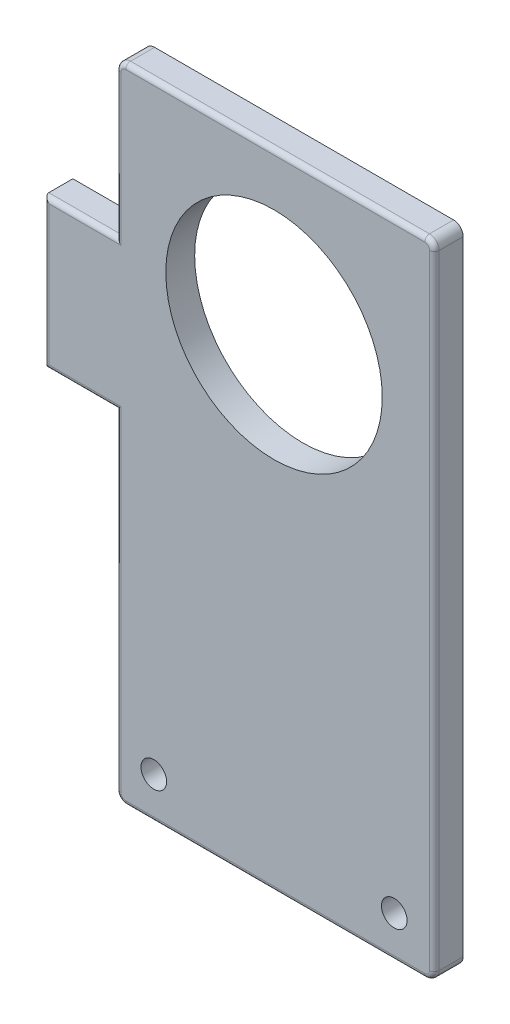
ISO-10303-21;
HEADER;
FILE_DESCRIPTION(('STEP AP214'),'2;1');
FILE_NAME('part.step','',(''),(''),'','','');
FILE_SCHEMA(('AUTOMOTIVE_DESIGN { 1 0 10303 214 1 1 1 1 }'));
ENDSEC;
DATA;
#1=APPLICATION_CONTEXT('core data for automotive mechanical design processes');
#2=APPLICATION_PROTOCOL_DEFINITION('international standard','automotive_design',2000,#1);
#3=PRODUCT_CONTEXT('',#1,'mechanical');
#4=PRODUCT('Part','Part','',(#3));
#5=PRODUCT_RELATED_PRODUCT_CATEGORY('part','',(#4));
#6=PRODUCT_DEFINITION_FORMATION('','',#4);
#7=PRODUCT_DEFINITION_CONTEXT('part definition',#1,'design');
#8=PRODUCT_DEFINITION('design','',#6,#7);
#9=PRODUCT_DEFINITION_SHAPE('','',#8);
#10=(LENGTH_UNIT() NAMED_UNIT(*) SI_UNIT(.MILLI.,.METRE.));
#11=(NAMED_UNIT(*) PLANE_ANGLE_UNIT() SI_UNIT($,.RADIAN.));
#12=(NAMED_UNIT(*) SI_UNIT($,.STERADIAN.) SOLID_ANGLE_UNIT());
#13=UNCERTAINTY_MEASURE_WITH_UNIT(LENGTH_MEASURE(1.E-05),#10,'distance_accuracy_value','');
#14=(GEOMETRIC_REPRESENTATION_CONTEXT(3) GLOBAL_UNCERTAINTY_ASSIGNED_CONTEXT((#13)) GLOBAL_UNIT_ASSIGNED_CONTEXT((#10,
#11,#12)) REPRESENTATION_CONTEXT('',''));
#15=CARTESIAN_POINT('',(0.,0.,0.));
#16=DIRECTION('',(0.,0.,1.));
#17=DIRECTION('',(1.,0.,0.));
#18=AXIS2_PLACEMENT_3D('',#15,#16,#17);
#19=CARTESIAN_POINT('',(19.5,-39.6,1.8));
#20=DIRECTION('',(0.,0.,1.));
#21=DIRECTION('',(1.,0.,0.));
#22=AXIS2_PLACEMENT_3D('',#19,#20,#21);
#23=PLANE('',#22);
#24=CARTESIAN_POINT('',(19.5,-0.7,1.8));
#25=DIRECTION('',(0.,0.,1.));
#26=DIRECTION('',(1.,0.,0.));
#27=AXIS2_PLACEMENT_3D('',#24,#25,#26);
#28=CIRCLE('',#27,0.3);
#29=CARTESIAN_POINT('',(19.8,-0.7,1.8));
#30=VERTEX_POINT('',#29);
#31=CARTESIAN_POINT('',(19.5,-0.4,1.8));
#32=VERTEX_POINT('',#31);
#33=EDGE_CURVE('E269',#30,#32,#28,.T.);
#34=ORIENTED_EDGE('',*,*,#33,.T.);
#35=DIRECTION('',(-1.,0.,0.));
#36=VECTOR('',#35,1.);
#37=CARTESIAN_POINT('',(19.5,-0.399999999999998,1.8));
#38=LINE('',#37,#36);
#39=CARTESIAN_POINT('',(0.85,-0.4,1.8));
#40=VERTEX_POINT('',#39);
#41=EDGE_CURVE('E284',#32,#40,#38,.T.);
#42=ORIENTED_EDGE('',*,*,#41,.T.);
#43=CARTESIAN_POINT('',(0.85,-0.7,1.8));
#44=DIRECTION('',(0.,0.,1.));
#45=DIRECTION('',(1.,0.,0.));
#46=AXIS2_PLACEMENT_3D('',#43,#44,#45);
#47=CIRCLE('',#46,0.3);
#48=CARTESIAN_POINT('',(0.549999999999999,-0.7,1.8));
#49=VERTEX_POINT('',#48);
#50=EDGE_CURVE('E282',#40,#49,#47,.T.);
#51=ORIENTED_EDGE('',*,*,#50,.T.);
#52=DIRECTION('',(0.,-1.,0.));
#53=VECTOR('',#52,1.);
#54=CARTESIAN_POINT('',(0.549999999999998,-39.6,1.8));
#55=LINE('',#54,#53);
#56=CARTESIAN_POINT('',(0.549999999999999,-10.05,1.8));
#57=VERTEX_POINT('',#56);
#58=EDGE_CURVE('E280',#49,#57,#55,.T.);
#59=ORIENTED_EDGE('',*,*,#58,.T.);
#60=DIRECTION('',(-1.,0.,0.));
#61=VECTOR('',#60,1.);
#62=CARTESIAN_POINT('',(19.5,-10.05,1.8));
#63=LINE('',#62,#61);
#64=CARTESIAN_POINT('',(-3.95,-10.05,1.8));
#65=VERTEX_POINT('',#64);
#66=EDGE_CURVE('E278',#57,#65,#63,.T.);
#67=ORIENTED_EDGE('',*,*,#66,.T.);
#68=DIRECTION('',(0.,-1.,0.));
#69=VECTOR('',#68,1.);
#70=CARTESIAN_POINT('',(-3.95,-39.6,1.8));
#71=LINE('',#70,#69);
#72=CARTESIAN_POINT('',(-3.95,-18.75,1.8));
#73=VERTEX_POINT('',#72);
#74=EDGE_CURVE('E276',#65,#73,#71,.T.);
#75=ORIENTED_EDGE('',*,*,#74,.T.);
#76=DIRECTION('',(1.,0.,0.));
#77=VECTOR('',#76,1.);
#78=CARTESIAN_POINT('',(19.5,-18.75,1.8));
#79=LINE('',#78,#77);
#80=CARTESIAN_POINT('',(0.549999999999998,-18.75,1.8));
#81=VERTEX_POINT('',#80);
#82=EDGE_CURVE('E274',#73,#81,#79,.T.);
#83=ORIENTED_EDGE('',*,*,#82,.T.);
#84=DIRECTION('',(0.,-1.,0.));
#85=VECTOR('',#84,1.);
#86=CARTESIAN_POINT('',(0.549999999999998,-39.6,1.8));
#87=LINE('',#86,#85);
#88=CARTESIAN_POINT('',(0.550000000000001,-39.6,1.8));
#89=VERTEX_POINT('',#88);
#90=EDGE_CURVE('E272',#81,#89,#87,.T.);
#91=ORIENTED_EDGE('',*,*,#90,.T.);
#92=CARTESIAN_POINT('',(0.849999999999999,-39.6,1.8));
#93=DIRECTION('',(0.,0.,1.));
#94=DIRECTION('',(1.,0.,0.));
#95=AXIS2_PLACEMENT_3D('',#92,#93,#94);
#96=CIRCLE('',#95,0.299999999999998);
#97=CARTESIAN_POINT('',(0.849999999999999,-39.9,1.8));
#98=VERTEX_POINT('',#97);
#99=EDGE_CURVE('E267',#89,#98,#96,.T.);
#100=ORIENTED_EDGE('',*,*,#99,.T.);
#101=DIRECTION('',(1.,0.,0.));
#102=VECTOR('',#101,1.);
#103=CARTESIAN_POINT('',(19.5,-39.9,1.8));
#104=LINE('',#103,#102);
#105=CARTESIAN_POINT('',(19.5,-39.9,1.8));
#106=VERTEX_POINT('',#105);
#107=EDGE_CURVE('E265',#98,#106,#104,.T.);
#108=ORIENTED_EDGE('',*,*,#107,.T.);
#109=CARTESIAN_POINT('',(19.5,-39.6,1.8));
#110=DIRECTION('',(0.,0.,1.));
#111=DIRECTION('',(1.,0.,0.));
#112=AXIS2_PLACEMENT_3D('',#109,#110,#111);
#113=CIRCLE('',#112,0.3);
#114=CARTESIAN_POINT('',(19.8,-39.6,1.8));
#115=VERTEX_POINT('',#114);
#116=EDGE_CURVE('E263',#106,#115,#113,.T.);
#117=ORIENTED_EDGE('',*,*,#116,.T.);
#118=DIRECTION('',(0.,1.,0.));
#119=VECTOR('',#118,1.);
#120=CARTESIAN_POINT('',(19.8,-39.6,1.8));
#121=LINE('',#120,#119);
#122=EDGE_CURVE('E255',#115,#30,#121,.T.);
#123=ORIENTED_EDGE('',*,*,#122,.T.);
#124=EDGE_LOOP('',(#34,#42,#51,#59,#67,#75,#83,#91,#100,#108,#117,#123));
#125=FACE_BOUND('',#124,.T.);
#126=CARTESIAN_POINT('',(10.1,-10.1,1.8));
#127=DIRECTION('',(0.,0.,1.));
#128=DIRECTION('',(1.,0.,0.));
#129=AXIS2_PLACEMENT_3D('',#126,#127,#128);
#130=CIRCLE('',#129,6.75);
#131=CARTESIAN_POINT('',(16.85,-10.1,1.8));
#132=VERTEX_POINT('',#131);
#133=EDGE_CURVE('E252',#132,#132,#130,.T.);
#134=ORIENTED_EDGE('',*,*,#133,.F.);
#135=EDGE_LOOP('',(#134));
#136=FACE_BOUND('',#135,.T.);
#137=CARTESIAN_POINT('',(17.6,-37.6,1.8));
#138=DIRECTION('',(0.,0.,1.));
#139=DIRECTION('',(1.,0.,0.));
#140=AXIS2_PLACEMENT_3D('',#137,#138,#139);
#141=CIRCLE('',#140,0.8);
#142=CARTESIAN_POINT('',(18.4,-37.6,1.8));
#143=VERTEX_POINT('',#142);
#144=EDGE_CURVE('E244',#143,#143,#141,.T.);
#145=ORIENTED_EDGE('',*,*,#144,.F.);
#146=EDGE_LOOP('',(#145));
#147=FACE_BOUND('',#146,.T.);
#148=CARTESIAN_POINT('',(2.6,-37.6,1.8));
#149=DIRECTION('',(0.,0.,1.));
#150=DIRECTION('',(-1.,0.,0.));
#151=AXIS2_PLACEMENT_3D('',#148,#149,#150);
#152=CIRCLE('',#151,0.8);
#153=CARTESIAN_POINT('',(1.8,-37.6,1.8));
#154=VERTEX_POINT('',#153);
#155=EDGE_CURVE('E248',#154,#154,#152,.T.);
#156=ORIENTED_EDGE('',*,*,#155,.F.);
#157=EDGE_LOOP('',(#156));
#158=FACE_BOUND('',#157,.T.);
#159=ADVANCED_FACE('F35',(#125,#136,#147,#158),#23,.T.);
#160=CARTESIAN_POINT('',(19.5,-39.6,0.));
#161=DIRECTION('',(0.,0.,1.));
#162=DIRECTION('',(1.,0.,0.));
#163=AXIS2_PLACEMENT_3D('',#160,#161,#162);
#164=PLANE('',#163);
#165=CARTESIAN_POINT('',(10.1,-10.1,0.));
#166=DIRECTION('',(0.,0.,1.));
#167=DIRECTION('',(1.,0.,0.));
#168=AXIS2_PLACEMENT_3D('',#165,#166,#167);
#169=CIRCLE('',#168,6.75);
#170=CARTESIAN_POINT('',(16.85,-10.1,0.));
#171=VERTEX_POINT('',#170);
#172=EDGE_CURVE('E247',#171,#171,#169,.T.);
#173=ORIENTED_EDGE('',*,*,#172,.T.);
#174=EDGE_LOOP('',(#173));
#175=FACE_BOUND('',#174,.T.);
#176=CARTESIAN_POINT('',(2.6,-37.6,0.));
#177=DIRECTION('',(0.,0.,-1.));
#178=DIRECTION('',(-1.,0.,0.));
#179=AXIS2_PLACEMENT_3D('',#176,#177,#178);
#180=CIRCLE('',#179,1.75);
#181=CARTESIAN_POINT('',(0.850000000000001,-37.6,0.));
#182=VERTEX_POINT('',#181);
#183=EDGE_CURVE('E213',#182,#182,#180,.T.);
#184=ORIENTED_EDGE('',*,*,#183,.F.);
#185=EDGE_LOOP('',(#184));
#186=FACE_BOUND('',#185,.T.);
#187=CARTESIAN_POINT('',(17.6,-37.6,0.));
#188=DIRECTION('',(0.,0.,-1.));
#189=DIRECTION('',(-1.,0.,0.));
#190=AXIS2_PLACEMENT_3D('',#187,#188,#189);
#191=CIRCLE('',#190,1.75);
#192=CARTESIAN_POINT('',(15.85,-37.6,0.));
#193=VERTEX_POINT('',#192);
#194=EDGE_CURVE('E235',#193,#193,#191,.T.);
#195=ORIENTED_EDGE('',*,*,#194,.F.);
#196=EDGE_LOOP('',(#195));
#197=FACE_BOUND('',#196,.T.);
#198=CARTESIAN_POINT('',(19.5,-39.6,0.));
#199=DIRECTION('',(0.,0.,-1.));
#200=DIRECTION('',(-1.,0.,0.));
#201=AXIS2_PLACEMENT_3D('',#198,#199,#200);
#202=CIRCLE('',#201,0.6);
#203=CARTESIAN_POINT('',(20.1,-39.6,0.));
#204=VERTEX_POINT('',#203);
#205=CARTESIAN_POINT('',(19.5,-40.2,0.));
#206=VERTEX_POINT('',#205);
#207=EDGE_CURVE('E178',#204,#206,#202,.T.);
#208=ORIENTED_EDGE('',*,*,#207,.T.);
#209=DIRECTION('',(-1.,0.,0.));
#210=VECTOR('',#209,1.);
#211=CARTESIAN_POINT('',(0.,-40.2,0.));
#212=LINE('',#211,#210);
#213=CARTESIAN_POINT('',(0.85,-40.2,0.));
#214=VERTEX_POINT('',#213);
#215=EDGE_CURVE('E208',#206,#214,#212,.T.);
#216=ORIENTED_EDGE('',*,*,#215,.T.);
#217=CARTESIAN_POINT('',(0.849999999999999,-39.6,0.));
#218=DIRECTION('',(0.,0.,-1.));
#219=DIRECTION('',(-1.,0.,0.));
#220=AXIS2_PLACEMENT_3D('',#217,#218,#219);
#221=CIRCLE('',#220,0.599999999999998);
#222=CARTESIAN_POINT('',(0.249999999999999,-39.6,0.));
#223=VERTEX_POINT('',#222);
#224=EDGE_CURVE('E205',#214,#223,#221,.T.);
#225=ORIENTED_EDGE('',*,*,#224,.T.);
#226=DIRECTION('',(0.,1.,0.));
#227=VECTOR('',#226,1.);
#228=CARTESIAN_POINT('',(0.249999999999999,0.,0.));
#229=LINE('',#228,#227);
#230=CARTESIAN_POINT('',(0.249999999999999,-19.05,0.));
#231=VERTEX_POINT('',#230);
#232=EDGE_CURVE('E202',#223,#231,#229,.T.);
#233=ORIENTED_EDGE('',*,*,#232,.T.);
#234=DIRECTION('',(-1.,0.,0.));
#235=VECTOR('',#234,1.);
#236=CARTESIAN_POINT('',(0.,-19.05,0.));
#237=LINE('',#236,#235);
#238=CARTESIAN_POINT('',(-4.25,-19.05,0.));
#239=VERTEX_POINT('',#238);
#240=EDGE_CURVE('E199',#231,#239,#237,.T.);
#241=ORIENTED_EDGE('',*,*,#240,.T.);
#242=DIRECTION('',(0.,1.,0.));
#243=VECTOR('',#242,1.);
#244=CARTESIAN_POINT('',(-4.25,0.,0.));
#245=LINE('',#244,#243);
#246=CARTESIAN_POINT('',(-4.25,-9.75,0.));
#247=VERTEX_POINT('',#246);
#248=EDGE_CURVE('E196',#239,#247,#245,.T.);
#249=ORIENTED_EDGE('',*,*,#248,.T.);
#250=DIRECTION('',(1.,0.,0.));
#251=VECTOR('',#250,1.);
#252=CARTESIAN_POINT('',(0.,-9.75,0.));
#253=LINE('',#252,#251);
#254=CARTESIAN_POINT('',(0.25,-9.75,0.));
#255=VERTEX_POINT('',#254);
#256=EDGE_CURVE('E193',#247,#255,#253,.T.);
#257=ORIENTED_EDGE('',*,*,#256,.T.);
#258=DIRECTION('',(0.,1.,0.));
#259=VECTOR('',#258,1.);
#260=CARTESIAN_POINT('',(0.25,0.,0.));
#261=LINE('',#260,#259);
#262=CARTESIAN_POINT('',(0.25,-0.699999999999999,0.));
#263=VERTEX_POINT('',#262);
#264=EDGE_CURVE('E190',#255,#263,#261,.T.);
#265=ORIENTED_EDGE('',*,*,#264,.T.);
#266=CARTESIAN_POINT('',(0.85,-0.7,0.));
#267=DIRECTION('',(0.,0.,-1.));
#268=DIRECTION('',(-1.,0.,0.));
#269=AXIS2_PLACEMENT_3D('',#266,#267,#268);
#270=CIRCLE('',#269,0.6);
#271=CARTESIAN_POINT('',(0.85,-0.1,0.));
#272=VERTEX_POINT('',#271);
#273=EDGE_CURVE('E185',#263,#272,#270,.T.);
#274=ORIENTED_EDGE('',*,*,#273,.T.);
#275=DIRECTION('',(1.,0.,0.));
#276=VECTOR('',#275,1.);
#277=CARTESIAN_POINT('',(0.,-0.1,0.));
#278=LINE('',#277,#276);
#279=CARTESIAN_POINT('',(19.5,-0.1,0.));
#280=VERTEX_POINT('',#279);
#281=EDGE_CURVE('E183',#272,#280,#278,.T.);
#282=ORIENTED_EDGE('',*,*,#281,.T.);
#283=CARTESIAN_POINT('',(19.5,-0.7,0.));
#284=DIRECTION('',(0.,0.,-1.));
#285=DIRECTION('',(-1.,0.,0.));
#286=AXIS2_PLACEMENT_3D('',#283,#284,#285);
#287=CIRCLE('',#286,0.6);
#288=CARTESIAN_POINT('',(20.1,-0.7,0.));
#289=VERTEX_POINT('',#288);
#290=EDGE_CURVE('E165',#280,#289,#287,.T.);
#291=ORIENTED_EDGE('',*,*,#290,.T.);
#292=DIRECTION('',(0.,-1.,0.));
#293=VECTOR('',#292,1.);
#294=CARTESIAN_POINT('',(20.1,0.,0.));
#295=LINE('',#294,#293);
#296=EDGE_CURVE('E173',#289,#204,#295,.T.);
#297=ORIENTED_EDGE('',*,*,#296,.T.);
#298=EDGE_LOOP('',(#208,#216,#225,#233,#241,#249,#257,#265,#274,#282,#291,#297));
#299=FACE_BOUND('',#298,.T.);
#300=ADVANCED_FACE('F180',(#175,#186,#197,#299),#164,.F.);
#301=CARTESIAN_POINT('',(17.6,-37.6,-0.2));
#302=DIRECTION('',(0.,0.,1.));
#303=DIRECTION('',(1.,0.,0.));
#304=AXIS2_PLACEMENT_3D('',#301,#302,#303);
#305=CYLINDRICAL_SURFACE('',#304,0.8);
#306=ORIENTED_EDGE('',*,*,#144,.T.);
#307=EDGE_LOOP('',(#306));
#308=FACE_BOUND('',#307,.T.);
#309=CARTESIAN_POINT('',(17.6,-37.6,0.5));
#310=DIRECTION('',(0.,0.,-1.));
#311=DIRECTION('',(-1.,0.,0.));
#312=AXIS2_PLACEMENT_3D('',#309,#310,#311);
#313=CIRCLE('',#312,0.8);
#314=CARTESIAN_POINT('',(16.8,-37.6,0.5));
#315=VERTEX_POINT('',#314);
#316=EDGE_CURVE('E251',#315,#315,#313,.F.);
#317=ORIENTED_EDGE('',*,*,#316,.F.);
#318=EDGE_LOOP('',(#317));
#319=FACE_BOUND('',#318,.T.);
#320=ADVANCED_FACE('F443',(#308,#319),#305,.F.);
#321=CARTESIAN_POINT('',(2.6,-37.6,-0.2));
#322=DIRECTION('',(0.,0.,1.));
#323=DIRECTION('',(1.,0.,0.));
#324=AXIS2_PLACEMENT_3D('',#321,#322,#323);
#325=CYLINDRICAL_SURFACE('',#324,0.8);
#326=ORIENTED_EDGE('',*,*,#155,.T.);
#327=EDGE_LOOP('',(#326));
#328=FACE_BOUND('',#327,.T.);
#329=CARTESIAN_POINT('',(2.6,-37.6,0.5));
#330=DIRECTION('',(0.,0.,-1.));
#331=DIRECTION('',(-1.,0.,0.));
#332=AXIS2_PLACEMENT_3D('',#329,#330,#331);
#333=CIRCLE('',#332,0.8);
#334=CARTESIAN_POINT('',(1.8,-37.6,0.5));
#335=VERTEX_POINT('',#334);
#336=EDGE_CURVE('E241',#335,#335,#333,.F.);
#337=ORIENTED_EDGE('',*,*,#336,.F.);
#338=EDGE_LOOP('',(#337));
#339=FACE_BOUND('',#338,.T.);
#340=ADVANCED_FACE('F682',(#328,#339),#325,.F.);
#341=CARTESIAN_POINT('',(10.1,-10.1,1.8));
#342=DIRECTION('',(0.,0.,-1.));
#343=DIRECTION('',(-1.,0.,0.));
#344=AXIS2_PLACEMENT_3D('',#341,#342,#343);
#345=CYLINDRICAL_SURFACE('',#344,6.75);
#346=ORIENTED_EDGE('',*,*,#133,.T.);
#347=EDGE_LOOP('',(#346));
#348=FACE_BOUND('',#347,.T.);
#349=ORIENTED_EDGE('',*,*,#172,.F.);
#350=EDGE_LOOP('',(#349));
#351=FACE_BOUND('',#350,.T.);
#352=ADVANCED_FACE('F447',(#348,#351),#345,.F.);
#353=CARTESIAN_POINT('',(2.6,-37.6,0.5));
#354=DIRECTION('',(0.,0.,-1.));
#355=DIRECTION('',(-1.,0.,0.));
#356=AXIS2_PLACEMENT_3D('',#353,#354,#355);
#357=PLANE('',#356);
#358=CARTESIAN_POINT('',(2.6,-37.6,0.5));
#359=DIRECTION('',(0.,0.,-1.));
#360=DIRECTION('',(-1.,0.,0.));
#361=AXIS2_PLACEMENT_3D('',#358,#359,#360);
#362=CIRCLE('',#361,1.75);
#363=CARTESIAN_POINT('',(0.850000000000001,-37.6,0.5));
#364=VERTEX_POINT('',#363);
#365=EDGE_CURVE('E232',#364,#364,#362,.T.);
#366=ORIENTED_EDGE('',*,*,#365,.T.);
#367=EDGE_LOOP('',(#366));
#368=FACE_BOUND('',#367,.T.);
#369=ORIENTED_EDGE('',*,*,#336,.T.);
#370=EDGE_LOOP('',(#369));
#371=FACE_BOUND('',#370,.T.);
#372=ADVANCED_FACE('F665',(#368,#371),#357,.T.);
#373=CARTESIAN_POINT('',(2.6,-37.6,0.5));
#374=DIRECTION('',(0.,0.,-1.));
#375=DIRECTION('',(-1.,0.,0.));
#376=AXIS2_PLACEMENT_3D('',#373,#374,#375);
#377=CYLINDRICAL_SURFACE('',#376,1.75);
#378=ORIENTED_EDGE('',*,*,#365,.F.);
#379=EDGE_LOOP('',(#378));
#380=FACE_BOUND('',#379,.T.);
#381=ORIENTED_EDGE('',*,*,#183,.T.);
#382=EDGE_LOOP('',(#381));
#383=FACE_BOUND('',#382,.T.);
#384=ADVANCED_FACE('F655',(#380,#383),#377,.F.);
#385=CARTESIAN_POINT('',(17.6,-37.6,0.5));
#386=DIRECTION('',(0.,0.,-1.));
#387=DIRECTION('',(-1.,0.,0.));
#388=AXIS2_PLACEMENT_3D('',#385,#386,#387);
#389=PLANE('',#388);
#390=CARTESIAN_POINT('',(17.6,-37.6,0.5));
#391=DIRECTION('',(0.,0.,-1.));
#392=DIRECTION('',(-1.,0.,0.));
#393=AXIS2_PLACEMENT_3D('',#390,#391,#392);
#394=CIRCLE('',#393,1.75);
#395=CARTESIAN_POINT('',(15.85,-37.6,0.5));
#396=VERTEX_POINT('',#395);
#397=EDGE_CURVE('E238',#396,#396,#394,.T.);
#398=ORIENTED_EDGE('',*,*,#397,.T.);
#399=EDGE_LOOP('',(#398));
#400=FACE_BOUND('',#399,.T.);
#401=ORIENTED_EDGE('',*,*,#316,.T.);
#402=EDGE_LOOP('',(#401));
#403=FACE_BOUND('',#402,.T.);
#404=ADVANCED_FACE('F644',(#400,#403),#389,.T.);
#405=CARTESIAN_POINT('',(17.6,-37.6,0.5));
#406=DIRECTION('',(0.,0.,-1.));
#407=DIRECTION('',(-1.,0.,0.));
#408=AXIS2_PLACEMENT_3D('',#405,#406,#407);
#409=CYLINDRICAL_SURFACE('',#408,1.75);
#410=ORIENTED_EDGE('',*,*,#397,.F.);
#411=EDGE_LOOP('',(#410));
#412=FACE_BOUND('',#411,.T.);
#413=ORIENTED_EDGE('',*,*,#194,.T.);
#414=EDGE_LOOP('',(#413));
#415=FACE_BOUND('',#414,.T.);
#416=ADVANCED_FACE('F608',(#412,#415),#409,.F.);
#417=CARTESIAN_POINT('',(19.5,-39.6,10.));
#418=DIRECTION('',(0.,0.,-1.));
#419=DIRECTION('',(-1.,0.,0.));
#420=AXIS2_PLACEMENT_3D('',#417,#418,#419);
#421=CYLINDRICAL_SURFACE('',#420,0.6);
#422=DIRECTION('',(0.,0.,-1.));
#423=VECTOR('',#422,1.);
#424=CARTESIAN_POINT('',(20.1,-39.6,10.));
#425=LINE('',#424,#423);
#426=CARTESIAN_POINT('',(20.1,-39.6,1.5));
#427=VERTEX_POINT('',#426);
#428=EDGE_CURVE('E170',#427,#204,#425,.T.);
#429=ORIENTED_EDGE('',*,*,#428,.F.);
#430=CARTESIAN_POINT('',(19.5,-39.6,1.5));
#431=DIRECTION('',(0.,0.,1.));
#432=DIRECTION('',(1.,0.,0.));
#433=AXIS2_PLACEMENT_3D('',#430,#431,#432);
#434=CIRCLE('',#433,0.6);
#435=CARTESIAN_POINT('',(19.5,-40.2,1.5));
#436=VERTEX_POINT('',#435);
#437=EDGE_CURVE('E44',#427,#436,#434,.F.);
#438=ORIENTED_EDGE('',*,*,#437,.T.);
#439=DIRECTION('',(0.,0.,-1.));
#440=VECTOR('',#439,1.);
#441=CARTESIAN_POINT('',(19.5,-40.2,10.));
#442=LINE('',#441,#440);
#443=EDGE_CURVE('E211',#436,#206,#442,.T.);
#444=ORIENTED_EDGE('',*,*,#443,.T.);
#445=ORIENTED_EDGE('',*,*,#207,.F.);
#446=EDGE_LOOP('',(#429,#438,#444,#445));
#447=FACE_BOUND('',#446,.T.);
#448=ADVANCED_FACE('F345',(#447),#421,.T.);
#449=CARTESIAN_POINT('',(0.,-40.2,10.));
#450=DIRECTION('',(0.,-1.,0.));
#451=DIRECTION('',(0.,0.,-1.));
#452=AXIS2_PLACEMENT_3D('',#449,#450,#451);
#453=PLANE('',#452);
#454=ORIENTED_EDGE('',*,*,#443,.F.);
#455=DIRECTION('',(1.,0.,0.));
#456=VECTOR('',#455,1.);
#457=CARTESIAN_POINT('',(0.,-40.2,1.5));
#458=LINE('',#457,#456);
#459=CARTESIAN_POINT('',(0.85,-40.2,1.5));
#460=VERTEX_POINT('',#459);
#461=EDGE_CURVE('E303',#436,#460,#458,.F.);
#462=ORIENTED_EDGE('',*,*,#461,.T.);
#463=DIRECTION('',(0.,0.,-1.));
#464=VECTOR('',#463,1.);
#465=CARTESIAN_POINT('',(0.85,-40.2,10.));
#466=LINE('',#465,#464);
#467=EDGE_CURVE('E214',#460,#214,#466,.T.);
#468=ORIENTED_EDGE('',*,*,#467,.T.);
#469=ORIENTED_EDGE('',*,*,#215,.F.);
#470=EDGE_LOOP('',(#454,#462,#468,#469));
#471=FACE_BOUND('',#470,.T.);
#472=ADVANCED_FACE('F348',(#471),#453,.T.);
#473=CARTESIAN_POINT('',(0.849999999999999,-39.6,10.));
#474=DIRECTION('',(0.,0.,-1.));
#475=DIRECTION('',(-1.,0.,0.));
#476=AXIS2_PLACEMENT_3D('',#473,#474,#475);
#477=CYLINDRICAL_SURFACE('',#476,0.599999999999998);
#478=ORIENTED_EDGE('',*,*,#467,.F.);
#479=CARTESIAN_POINT('',(0.849999999999999,-39.6,1.5));
#480=DIRECTION('',(0.,0.,1.));
#481=DIRECTION('',(1.,0.,0.));
#482=AXIS2_PLACEMENT_3D('',#479,#480,#481);
#483=CIRCLE('',#482,0.599999999999998);
#484=CARTESIAN_POINT('',(0.249999999999999,-39.6,1.5));
#485=VERTEX_POINT('',#484);
#486=EDGE_CURVE('E299',#460,#485,#483,.F.);
#487=ORIENTED_EDGE('',*,*,#486,.T.);
#488=DIRECTION('',(0.,0.,-1.));
#489=VECTOR('',#488,1.);
#490=CARTESIAN_POINT('',(0.249999999999999,-39.6,10.));
#491=LINE('',#490,#489);
#492=EDGE_CURVE('E216',#485,#223,#491,.T.);
#493=ORIENTED_EDGE('',*,*,#492,.T.);
#494=ORIENTED_EDGE('',*,*,#224,.F.);
#495=EDGE_LOOP('',(#478,#487,#493,#494));
#496=FACE_BOUND('',#495,.T.);
#497=ADVANCED_FACE('F353',(#496),#477,.T.);
#498=CARTESIAN_POINT('',(0.249999999999999,0.,10.));
#499=DIRECTION('',(-1.,0.,0.));
#500=DIRECTION('',(0.,-1.,0.));
#501=AXIS2_PLACEMENT_3D('',#498,#499,#500);
#502=PLANE('',#501);
#503=ORIENTED_EDGE('',*,*,#492,.F.);
#504=DIRECTION('',(0.,-1.,0.));
#505=VECTOR('',#504,1.);
#506=CARTESIAN_POINT('',(0.249999999999999,0.,1.5));
#507=LINE('',#506,#505);
#508=CARTESIAN_POINT('',(0.249999999999999,-19.05,1.5));
#509=VERTEX_POINT('',#508);
#510=EDGE_CURVE('E301',#485,#509,#507,.F.);
#511=ORIENTED_EDGE('',*,*,#510,.T.);
#512=DIRECTION('',(0.,0.,-1.));
#513=VECTOR('',#512,1.);
#514=CARTESIAN_POINT('',(0.249999999999999,-19.05,10.));
#515=LINE('',#514,#513);
#516=EDGE_CURVE('E218',#509,#231,#515,.T.);
#517=ORIENTED_EDGE('',*,*,#516,.T.);
#518=ORIENTED_EDGE('',*,*,#232,.F.);
#519=EDGE_LOOP('',(#503,#511,#517,#518));
#520=FACE_BOUND('',#519,.T.);
#521=ADVANCED_FACE('F358',(#520),#502,.T.);
#522=CARTESIAN_POINT('',(0.,-19.05,10.));
#523=DIRECTION('',(0.,-1.,0.));
#524=DIRECTION('',(0.,0.,-1.));
#525=AXIS2_PLACEMENT_3D('',#522,#523,#524);
#526=PLANE('',#525);
#527=ORIENTED_EDGE('',*,*,#516,.F.);
#528=DIRECTION('',(1.,0.,0.));
#529=VECTOR('',#528,1.);
#530=CARTESIAN_POINT('',(0.,-19.05,1.5));
#531=LINE('',#530,#529);
#532=CARTESIAN_POINT('',(-4.25,-19.05,1.5));
#533=VERTEX_POINT('',#532);
#534=EDGE_CURVE('E297',#509,#533,#531,.F.);
#535=ORIENTED_EDGE('',*,*,#534,.T.);
#536=DIRECTION('',(0.,0.,-1.));
#537=VECTOR('',#536,1.);
#538=CARTESIAN_POINT('',(-4.25,-19.05,10.));
#539=LINE('',#538,#537);
#540=EDGE_CURVE('E220',#533,#239,#539,.T.);
#541=ORIENTED_EDGE('',*,*,#540,.T.);
#542=ORIENTED_EDGE('',*,*,#240,.F.);
#543=EDGE_LOOP('',(#527,#535,#541,#542));
#544=FACE_BOUND('',#543,.T.);
#545=ADVANCED_FACE('F362',(#544),#526,.T.);
#546=CARTESIAN_POINT('',(-4.25,0.,10.));
#547=DIRECTION('',(-1.,0.,0.));
#548=DIRECTION('',(0.,0.,1.));
#549=AXIS2_PLACEMENT_3D('',#546,#547,#548);
#550=PLANE('',#549);
#551=ORIENTED_EDGE('',*,*,#540,.F.);
#552=DIRECTION('',(0.,-1.,0.));
#553=VECTOR('',#552,1.);
#554=CARTESIAN_POINT('',(-4.25,0.,1.5));
#555=LINE('',#554,#553);
#556=CARTESIAN_POINT('',(-4.25,-9.75,1.5));
#557=VERTEX_POINT('',#556);
#558=EDGE_CURVE('E295',#533,#557,#555,.F.);
#559=ORIENTED_EDGE('',*,*,#558,.T.);
#560=DIRECTION('',(0.,0.,-1.));
#561=VECTOR('',#560,1.);
#562=CARTESIAN_POINT('',(-4.25,-9.75,10.));
#563=LINE('',#562,#561);
#564=EDGE_CURVE('E222',#557,#247,#563,.T.);
#565=ORIENTED_EDGE('',*,*,#564,.T.);
#566=ORIENTED_EDGE('',*,*,#248,.F.);
#567=EDGE_LOOP('',(#551,#559,#565,#566));
#568=FACE_BOUND('',#567,.T.);
#569=ADVANCED_FACE('F366',(#568),#550,.T.);
#570=CARTESIAN_POINT('',(0.,-9.75,10.));
#571=DIRECTION('',(0.,1.,0.));
#572=DIRECTION('',(0.,0.,1.));
#573=AXIS2_PLACEMENT_3D('',#570,#571,#572);
#574=PLANE('',#573);
#575=ORIENTED_EDGE('',*,*,#564,.F.);
#576=DIRECTION('',(-1.,0.,0.));
#577=VECTOR('',#576,1.);
#578=CARTESIAN_POINT('',(0.,-9.75,1.5));
#579=LINE('',#578,#577);
#580=CARTESIAN_POINT('',(0.25,-9.75,1.5));
#581=VERTEX_POINT('',#580);
#582=EDGE_CURVE('E293',#557,#581,#579,.F.);
#583=ORIENTED_EDGE('',*,*,#582,.T.);
#584=DIRECTION('',(0.,0.,-1.));
#585=VECTOR('',#584,1.);
#586=CARTESIAN_POINT('',(0.25,-9.75,10.));
#587=LINE('',#586,#585);
#588=EDGE_CURVE('E224',#581,#255,#587,.T.);
#589=ORIENTED_EDGE('',*,*,#588,.T.);
#590=ORIENTED_EDGE('',*,*,#256,.F.);
#591=EDGE_LOOP('',(#575,#583,#589,#590));
#592=FACE_BOUND('',#591,.T.);
#593=ADVANCED_FACE('F371',(#592),#574,.T.);
#594=CARTESIAN_POINT('',(0.25,0.,10.));
#595=DIRECTION('',(-1.,0.,0.));
#596=DIRECTION('',(0.,-1.,0.));
#597=AXIS2_PLACEMENT_3D('',#594,#595,#596);
#598=PLANE('',#597);
#599=ORIENTED_EDGE('',*,*,#588,.F.);
#600=DIRECTION('',(0.,-1.,0.));
#601=VECTOR('',#600,1.);
#602=CARTESIAN_POINT('',(0.25,0.,1.5));
#603=LINE('',#602,#601);
#604=CARTESIAN_POINT('',(0.25,-0.699999999999999,1.5));
#605=VERTEX_POINT('',#604);
#606=EDGE_CURVE('E291',#581,#605,#603,.F.);
#607=ORIENTED_EDGE('',*,*,#606,.T.);
#608=DIRECTION('',(0.,0.,-1.));
#609=VECTOR('',#608,1.);
#610=CARTESIAN_POINT('',(0.25,-0.699999999999999,10.));
#611=LINE('',#610,#609);
#612=EDGE_CURVE('E226',#605,#263,#611,.T.);
#613=ORIENTED_EDGE('',*,*,#612,.T.);
#614=ORIENTED_EDGE('',*,*,#264,.F.);
#615=EDGE_LOOP('',(#599,#607,#613,#614));
#616=FACE_BOUND('',#615,.T.);
#617=ADVANCED_FACE('F377',(#616),#598,.T.);
#618=CARTESIAN_POINT('',(0.85,-0.7,10.));
#619=DIRECTION('',(0.,0.,-1.));
#620=DIRECTION('',(-1.,0.,0.));
#621=AXIS2_PLACEMENT_3D('',#618,#619,#620);
#622=CYLINDRICAL_SURFACE('',#621,0.6);
#623=ORIENTED_EDGE('',*,*,#612,.F.);
#624=CARTESIAN_POINT('',(0.85,-0.7,1.5));
#625=DIRECTION('',(0.,0.,1.));
#626=DIRECTION('',(1.,0.,0.));
#627=AXIS2_PLACEMENT_3D('',#624,#625,#626);
#628=CIRCLE('',#627,0.6);
#629=CARTESIAN_POINT('',(0.85,-0.1,1.5));
#630=VERTEX_POINT('',#629);
#631=EDGE_CURVE('E289',#605,#630,#628,.F.);
#632=ORIENTED_EDGE('',*,*,#631,.T.);
#633=DIRECTION('',(0.,0.,-1.));
#634=VECTOR('',#633,1.);
#635=CARTESIAN_POINT('',(0.85,-0.1,10.));
#636=LINE('',#635,#634);
#637=EDGE_CURVE('E228',#630,#272,#636,.T.);
#638=ORIENTED_EDGE('',*,*,#637,.T.);
#639=ORIENTED_EDGE('',*,*,#273,.F.);
#640=EDGE_LOOP('',(#623,#632,#638,#639));
#641=FACE_BOUND('',#640,.T.);
#642=ADVANCED_FACE('F383',(#641),#622,.T.);
#643=CARTESIAN_POINT('',(0.,-0.1,10.));
#644=DIRECTION('',(0.,1.,0.));
#645=DIRECTION('',(-1.,0.,0.));
#646=AXIS2_PLACEMENT_3D('',#643,#644,#645);
#647=PLANE('',#646);
#648=ORIENTED_EDGE('',*,*,#637,.F.);
#649=DIRECTION('',(-1.,0.,0.));
#650=VECTOR('',#649,1.);
#651=CARTESIAN_POINT('',(0.,-0.1,1.5));
#652=LINE('',#651,#650);
#653=CARTESIAN_POINT('',(19.5,-0.1,1.5));
#654=VERTEX_POINT('',#653);
#655=EDGE_CURVE('E287',#630,#654,#652,.F.);
#656=ORIENTED_EDGE('',*,*,#655,.T.);
#657=DIRECTION('',(0.,0.,-1.));
#658=VECTOR('',#657,1.);
#659=CARTESIAN_POINT('',(19.5,-0.1,10.));
#660=LINE('',#659,#658);
#661=EDGE_CURVE('E169',#654,#280,#660,.T.);
#662=ORIENTED_EDGE('',*,*,#661,.T.);
#663=ORIENTED_EDGE('',*,*,#281,.F.);
#664=EDGE_LOOP('',(#648,#656,#662,#663));
#665=FACE_BOUND('',#664,.T.);
#666=ADVANCED_FACE('F388',(#665),#647,.T.);
#667=CARTESIAN_POINT('',(19.5,-0.7,10.));
#668=DIRECTION('',(0.,0.,-1.));
#669=DIRECTION('',(-1.,0.,0.));
#670=AXIS2_PLACEMENT_3D('',#667,#668,#669);
#671=CYLINDRICAL_SURFACE('',#670,0.6);
#672=ORIENTED_EDGE('',*,*,#661,.F.);
#673=CARTESIAN_POINT('',(19.5,-0.7,1.5));
#674=DIRECTION('',(0.,0.,1.));
#675=DIRECTION('',(1.,0.,0.));
#676=AXIS2_PLACEMENT_3D('',#673,#674,#675);
#677=CIRCLE('',#676,0.6);
#678=CARTESIAN_POINT('',(20.1,-0.7,1.5));
#679=VERTEX_POINT('',#678);
#680=EDGE_CURVE('E168',#654,#679,#677,.F.);
#681=ORIENTED_EDGE('',*,*,#680,.T.);
#682=DIRECTION('',(0.,0.,-1.));
#683=VECTOR('',#682,1.);
#684=CARTESIAN_POINT('',(20.1,-0.7,10.));
#685=LINE('',#684,#683);
#686=EDGE_CURVE('E160',#679,#289,#685,.T.);
#687=ORIENTED_EDGE('',*,*,#686,.T.);
#688=ORIENTED_EDGE('',*,*,#290,.F.);
#689=EDGE_LOOP('',(#672,#681,#687,#688));
#690=FACE_BOUND('',#689,.T.);
#691=ADVANCED_FACE('F163',(#690),#671,.T.);
#692=CARTESIAN_POINT('',(20.1,0.,10.));
#693=DIRECTION('',(1.,0.,0.));
#694=DIRECTION('',(0.,1.,0.));
#695=AXIS2_PLACEMENT_3D('',#692,#693,#694);
#696=PLANE('',#695);
#697=ORIENTED_EDGE('',*,*,#686,.F.);
#698=DIRECTION('',(0.,1.,0.));
#699=VECTOR('',#698,1.);
#700=CARTESIAN_POINT('',(20.1,0.,1.5));
#701=LINE('',#700,#699);
#702=EDGE_CURVE('E11',#679,#427,#701,.F.);
#703=ORIENTED_EDGE('',*,*,#702,.T.);
#704=ORIENTED_EDGE('',*,*,#428,.T.);
#705=ORIENTED_EDGE('',*,*,#296,.F.);
#706=EDGE_LOOP('',(#697,#703,#704,#705));
#707=FACE_BOUND('',#706,.T.);
#708=ADVANCED_FACE('F174',(#707),#696,.T.);
#709=CARTESIAN_POINT('',(19.5,-18.75,1.5));
#710=DIRECTION('',(1.,0.,0.));
#711=DIRECTION('',(0.,0.,-1.));
#712=AXIS2_PLACEMENT_3D('',#709,#710,#711);
#713=CYLINDRICAL_SURFACE('',#712,0.3);
#714=CARTESIAN_POINT('',(-3.95,-18.75,1.5));
#715=DIRECTION('',(0.707106781186547,-0.707106781186547,0.));
#716=DIRECTION('',(0.707106781186547,0.707106781186547,0.));
#717=AXIS2_PLACEMENT_3D('',#714,#715,#716);
#718=ELLIPSE('',#717,0.424264068711928,0.3);
#719=EDGE_CURVE('E333',#533,#73,#718,.F.);
#720=ORIENTED_EDGE('',*,*,#719,.F.);
#721=ORIENTED_EDGE('',*,*,#534,.F.);
#722=CARTESIAN_POINT('',(0.549999999999998,-18.75,1.5));
#723=DIRECTION('',(0.707106781186547,-0.707106781186547,0.));
#724=DIRECTION('',(0.707106781186547,0.707106781186547,0.));
#725=AXIS2_PLACEMENT_3D('',#722,#723,#724);
#726=ELLIPSE('',#725,0.424264068711928,0.3);
#727=EDGE_CURVE('E39',#81,#509,#726,.T.);
#728=ORIENTED_EDGE('',*,*,#727,.F.);
#729=ORIENTED_EDGE('',*,*,#82,.F.);
#730=EDGE_LOOP('',(#720,#721,#728,#729));
#731=FACE_BOUND('',#730,.T.);
#732=ADVANCED_FACE('F37',(#731),#713,.T.);
#733=CARTESIAN_POINT('',(0.549999999999998,-39.6,1.5));
#734=DIRECTION('',(0.,-1.,0.));
#735=DIRECTION('',(1.,0.,0.));
#736=AXIS2_PLACEMENT_3D('',#733,#734,#735);
#737=CYLINDRICAL_SURFACE('',#736,0.3);
#738=ORIENTED_EDGE('',*,*,#727,.T.);
#739=ORIENTED_EDGE('',*,*,#510,.F.);
#740=CARTESIAN_POINT('',(0.549999999999998,-39.6,1.5));
#741=DIRECTION('',(0.,-1.,0.));
#742=DIRECTION('',(0.,0.,-1.));
#743=AXIS2_PLACEMENT_3D('',#740,#741,#742);
#744=CIRCLE('',#743,0.3);
#745=EDGE_CURVE('E331',#89,#485,#744,.T.);
#746=ORIENTED_EDGE('',*,*,#745,.F.);
#747=ORIENTED_EDGE('',*,*,#90,.F.);
#748=EDGE_LOOP('',(#738,#739,#746,#747));
#749=FACE_BOUND('',#748,.T.);
#750=ADVANCED_FACE('F417',(#749),#737,.T.);
#751=CARTESIAN_POINT('',(-3.95,-39.6,1.5));
#752=DIRECTION('',(0.,-1.,0.));
#753=DIRECTION('',(0.,0.,-1.));
#754=AXIS2_PLACEMENT_3D('',#751,#752,#753);
#755=CYLINDRICAL_SURFACE('',#754,0.3);
#756=ORIENTED_EDGE('',*,*,#719,.T.);
#757=ORIENTED_EDGE('',*,*,#74,.F.);
#758=CARTESIAN_POINT('',(-3.95,-10.05,1.5));
#759=DIRECTION('',(-0.707106781186547,-0.707106781186547,0.));
#760=DIRECTION('',(0.707106781186547,-0.707106781186547,0.));
#761=AXIS2_PLACEMENT_3D('',#758,#759,#760);
#762=ELLIPSE('',#761,0.424264068711928,0.3);
#763=EDGE_CURVE('E328',#557,#65,#762,.F.);
#764=ORIENTED_EDGE('',*,*,#763,.F.);
#765=ORIENTED_EDGE('',*,*,#558,.F.);
#766=EDGE_LOOP('',(#756,#757,#764,#765));
#767=FACE_BOUND('',#766,.T.);
#768=ADVANCED_FACE('F420',(#767),#755,.T.);
#769=CARTESIAN_POINT('',(0.849999999999999,-39.6,1.5));
#770=DIRECTION('',(0.,0.,1.));
#771=DIRECTION('',(1.,0.,0.));
#772=AXIS2_PLACEMENT_3D('',#769,#770,#771);
#773=DEGENERATE_TOROIDAL_SURFACE('',#772,0.299999999999998,0.3,.T.);
#774=ORIENTED_EDGE('',*,*,#745,.T.);
#775=ORIENTED_EDGE('',*,*,#486,.F.);
#776=CARTESIAN_POINT('',(0.849999999999999,-39.9,1.5));
#777=DIRECTION('',(1.,0.,0.));
#778=DIRECTION('',(0.,1.,0.));
#779=AXIS2_PLACEMENT_3D('',#776,#777,#778);
#780=CIRCLE('',#779,0.3);
#781=EDGE_CURVE('E325',#98,#460,#780,.T.);
#782=ORIENTED_EDGE('',*,*,#781,.F.);
#783=ORIENTED_EDGE('',*,*,#99,.F.);
#784=EDGE_LOOP('',(#774,#775,#782,#783));
#785=FACE_BOUND('',#784,.T.);
#786=ADVANCED_FACE('F415',(#785),#773,.T.);
#787=CARTESIAN_POINT('',(19.5,-10.05,1.5));
#788=DIRECTION('',(-1.,0.,0.));
#789=DIRECTION('',(0.,0.,1.));
#790=AXIS2_PLACEMENT_3D('',#787,#788,#789);
#791=CYLINDRICAL_SURFACE('',#790,0.3);
#792=ORIENTED_EDGE('',*,*,#763,.T.);
#793=ORIENTED_EDGE('',*,*,#66,.F.);
#794=CARTESIAN_POINT('',(0.549999999999998,-10.05,1.5));
#795=DIRECTION('',(-0.707106781186547,-0.707106781186547,0.));
#796=DIRECTION('',(0.707106781186547,-0.707106781186547,0.));
#797=AXIS2_PLACEMENT_3D('',#794,#795,#796);
#798=ELLIPSE('',#797,0.424264068711928,0.3);
#799=EDGE_CURVE('E322',#581,#57,#798,.F.);
#800=ORIENTED_EDGE('',*,*,#799,.F.);
#801=ORIENTED_EDGE('',*,*,#582,.F.);
#802=EDGE_LOOP('',(#792,#793,#800,#801));
#803=FACE_BOUND('',#802,.T.);
#804=ADVANCED_FACE('F423',(#803),#791,.T.);
#805=CARTESIAN_POINT('',(19.5,-39.9,1.5));
#806=DIRECTION('',(1.,0.,0.));
#807=DIRECTION('',(0.,0.,-1.));
#808=AXIS2_PLACEMENT_3D('',#805,#806,#807);
#809=CYLINDRICAL_SURFACE('',#808,0.3);
#810=ORIENTED_EDGE('',*,*,#781,.T.);
#811=ORIENTED_EDGE('',*,*,#461,.F.);
#812=CARTESIAN_POINT('',(19.5,-39.9,1.5));
#813=DIRECTION('',(1.,0.,0.));
#814=DIRECTION('',(0.,0.,-1.));
#815=AXIS2_PLACEMENT_3D('',#812,#813,#814);
#816=CIRCLE('',#815,0.3);
#817=EDGE_CURVE('E319',#106,#436,#816,.T.);
#818=ORIENTED_EDGE('',*,*,#817,.F.);
#819=ORIENTED_EDGE('',*,*,#107,.F.);
#820=EDGE_LOOP('',(#810,#811,#818,#819));
#821=FACE_BOUND('',#820,.T.);
#822=ADVANCED_FACE('F411',(#821),#809,.T.);
#823=CARTESIAN_POINT('',(0.549999999999998,-39.6,1.5));
#824=DIRECTION('',(0.,-1.,0.));
#825=DIRECTION('',(1.,0.,0.));
#826=AXIS2_PLACEMENT_3D('',#823,#824,#825);
#827=CYLINDRICAL_SURFACE('',#826,0.3);
#828=ORIENTED_EDGE('',*,*,#799,.T.);
#829=ORIENTED_EDGE('',*,*,#58,.F.);
#830=CARTESIAN_POINT('',(0.55,-0.699999999999999,1.5));
#831=DIRECTION('',(0.,1.,0.));
#832=DIRECTION('',(0.,0.,1.));
#833=AXIS2_PLACEMENT_3D('',#830,#831,#832);
#834=CIRCLE('',#833,0.3);
#835=EDGE_CURVE('E316',#605,#49,#834,.T.);
#836=ORIENTED_EDGE('',*,*,#835,.F.);
#837=ORIENTED_EDGE('',*,*,#606,.F.);
#838=EDGE_LOOP('',(#828,#829,#836,#837));
#839=FACE_BOUND('',#838,.T.);
#840=ADVANCED_FACE('F426',(#839),#827,.T.);
#841=CARTESIAN_POINT('',(19.5,-39.6,1.5));
#842=DIRECTION('',(0.,0.,1.));
#843=DIRECTION('',(1.,0.,0.));
#844=AXIS2_PLACEMENT_3D('',#841,#842,#843);
#845=DEGENERATE_TOROIDAL_SURFACE('',#844,0.3,0.3,.T.);
#846=ORIENTED_EDGE('',*,*,#817,.T.);
#847=ORIENTED_EDGE('',*,*,#437,.F.);
#848=CARTESIAN_POINT('',(19.8,-39.6,1.5));
#849=DIRECTION('',(0.,1.,0.));
#850=DIRECTION('',(0.,0.,1.));
#851=AXIS2_PLACEMENT_3D('',#848,#849,#850);
#852=CIRCLE('',#851,0.3);
#853=EDGE_CURVE('E313',#115,#427,#852,.T.);
#854=ORIENTED_EDGE('',*,*,#853,.F.);
#855=ORIENTED_EDGE('',*,*,#116,.F.);
#856=EDGE_LOOP('',(#846,#847,#854,#855));
#857=FACE_BOUND('',#856,.T.);
#858=ADVANCED_FACE('F407',(#857),#845,.T.);
#859=CARTESIAN_POINT('',(0.85,-0.7,1.5));
#860=DIRECTION('',(0.,0.,1.));
#861=DIRECTION('',(1.,0.,0.));
#862=AXIS2_PLACEMENT_3D('',#859,#860,#861);
#863=DEGENERATE_TOROIDAL_SURFACE('',#862,0.3,0.3,.T.);
#864=ORIENTED_EDGE('',*,*,#835,.T.);
#865=ORIENTED_EDGE('',*,*,#50,.F.);
#866=CARTESIAN_POINT('',(0.85,-0.4,1.5));
#867=DIRECTION('',(1.,0.,0.));
#868=DIRECTION('',(0.,0.,-1.));
#869=AXIS2_PLACEMENT_3D('',#866,#867,#868);
#870=CIRCLE('',#869,0.3);
#871=EDGE_CURVE('E310',#630,#40,#870,.T.);
#872=ORIENTED_EDGE('',*,*,#871,.F.);
#873=ORIENTED_EDGE('',*,*,#631,.F.);
#874=EDGE_LOOP('',(#864,#865,#872,#873));
#875=FACE_BOUND('',#874,.T.);
#876=ADVANCED_FACE('F428',(#875),#863,.T.);
#877=CARTESIAN_POINT('',(19.8,-39.6,1.5));
#878=DIRECTION('',(0.,1.,0.));
#879=DIRECTION('',(-1.,0.,0.));
#880=AXIS2_PLACEMENT_3D('',#877,#878,#879);
#881=CYLINDRICAL_SURFACE('',#880,0.3);
#882=ORIENTED_EDGE('',*,*,#853,.T.);
#883=ORIENTED_EDGE('',*,*,#702,.F.);
#884=CARTESIAN_POINT('',(19.8,-0.7,1.5));
#885=DIRECTION('',(0.,1.,0.));
#886=DIRECTION('',(-1.,0.,0.));
#887=AXIS2_PLACEMENT_3D('',#884,#885,#886);
#888=CIRCLE('',#887,0.3);
#889=EDGE_CURVE('E308',#30,#679,#888,.T.);
#890=ORIENTED_EDGE('',*,*,#889,.F.);
#891=ORIENTED_EDGE('',*,*,#122,.F.);
#892=EDGE_LOOP('',(#882,#883,#890,#891));
#893=FACE_BOUND('',#892,.T.);
#894=ADVANCED_FACE('F405',(#893),#881,.T.);
#895=CARTESIAN_POINT('',(19.5,-0.399999999999998,1.5));
#896=DIRECTION('',(-1.,0.,0.));
#897=DIRECTION('',(0.,-1.,0.));
#898=AXIS2_PLACEMENT_3D('',#895,#896,#897);
#899=CYLINDRICAL_SURFACE('',#898,0.3);
#900=ORIENTED_EDGE('',*,*,#871,.T.);
#901=ORIENTED_EDGE('',*,*,#41,.F.);
#902=CARTESIAN_POINT('',(19.5,-0.4,1.5));
#903=DIRECTION('',(1.,0.,0.));
#904=DIRECTION('',(0.,0.,-1.));
#905=AXIS2_PLACEMENT_3D('',#902,#903,#904);
#906=CIRCLE('',#905,0.3);
#907=EDGE_CURVE('E306',#654,#32,#906,.T.);
#908=ORIENTED_EDGE('',*,*,#907,.F.);
#909=ORIENTED_EDGE('',*,*,#655,.F.);
#910=EDGE_LOOP('',(#900,#901,#908,#909));
#911=FACE_BOUND('',#910,.T.);
#912=ADVANCED_FACE('F397',(#911),#899,.T.);
#913=CARTESIAN_POINT('',(19.5,-0.7,1.5));
#914=DIRECTION('',(0.,0.,1.));
#915=DIRECTION('',(1.,0.,0.));
#916=AXIS2_PLACEMENT_3D('',#913,#914,#915);
#917=DEGENERATE_TOROIDAL_SURFACE('',#916,0.3,0.3,.T.);
#918=ORIENTED_EDGE('',*,*,#889,.T.);
#919=ORIENTED_EDGE('',*,*,#680,.F.);
#920=ORIENTED_EDGE('',*,*,#907,.T.);
#921=ORIENTED_EDGE('',*,*,#33,.F.);
#922=EDGE_LOOP('',(#918,#919,#920,#921));
#923=FACE_BOUND('',#922,.T.);
#924=ADVANCED_FACE('F392',(#923),#917,.T.);
#925=CLOSED_SHELL('',(#159,#300,#320,#340,#352,#372,#384,#404,#416,#448,#472,#497,#521,#545,
#569,#593,#617,#642,#666,#691,#708,#732,#750,#768,#786,#804,#822,#840,#858,#876,#894,#912,#924));
#926=MANIFOLD_SOLID_BREP('B2',#925);
#927=ADVANCED_BREP_SHAPE_REPRESENTATION('',(#18,#926),#14);
#928=SHAPE_DEFINITION_REPRESENTATION(#9,#927);
ENDSEC;
END-ISO-10303-21;
